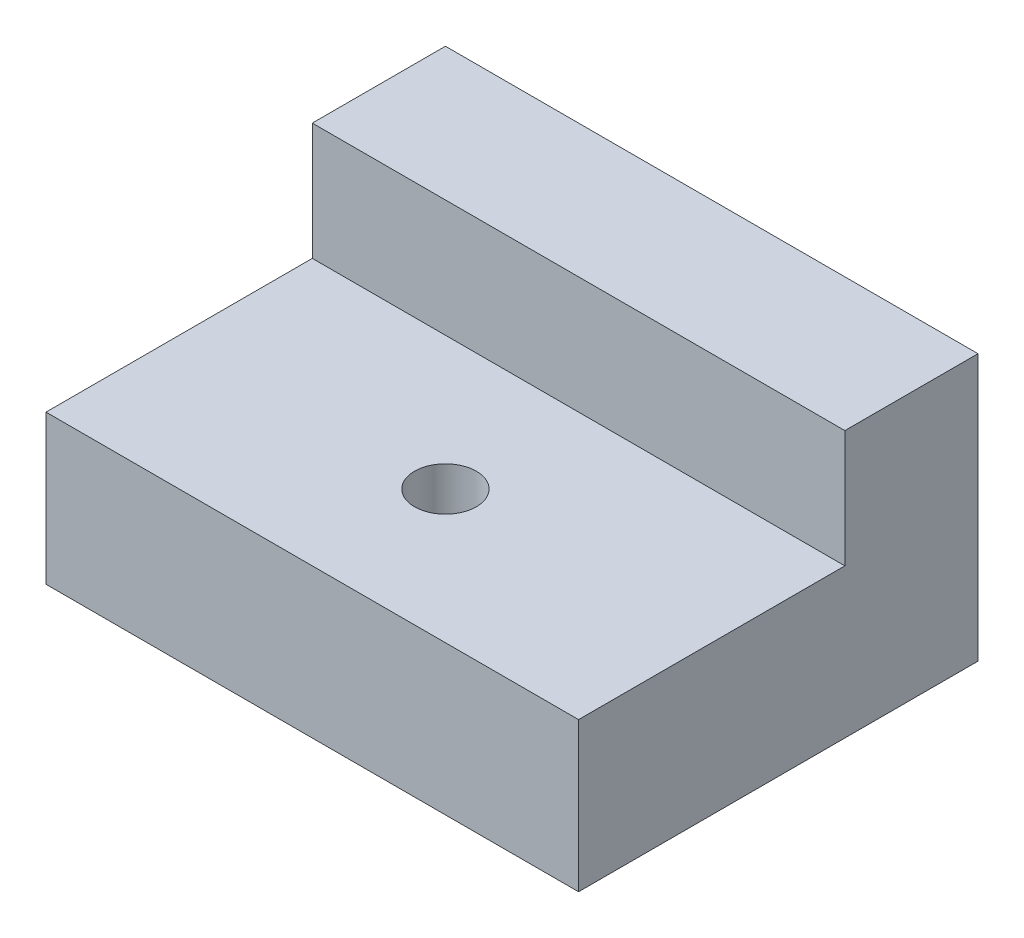
ISO-10303-21;
HEADER;
FILE_DESCRIPTION(('STEP AP214'),'2;1');
FILE_NAME('part.step','',(''),(''),'','','');
FILE_SCHEMA(('AUTOMOTIVE_DESIGN { 1 0 10303 214 1 1 1 1 }'));
ENDSEC;
DATA;
#1=APPLICATION_CONTEXT('core data for automotive mechanical design processes');
#2=APPLICATION_PROTOCOL_DEFINITION('international standard','automotive_design',2000,#1);
#3=PRODUCT_CONTEXT('',#1,'mechanical');
#4=PRODUCT('Part','Part','',(#3));
#5=PRODUCT_RELATED_PRODUCT_CATEGORY('part','',(#4));
#6=PRODUCT_DEFINITION_FORMATION('','',#4);
#7=PRODUCT_DEFINITION_CONTEXT('part definition',#1,'design');
#8=PRODUCT_DEFINITION('design','',#6,#7);
#9=PRODUCT_DEFINITION_SHAPE('','',#8);
#10=(LENGTH_UNIT() NAMED_UNIT(*) SI_UNIT(.MILLI.,.METRE.));
#11=(NAMED_UNIT(*) PLANE_ANGLE_UNIT() SI_UNIT($,.RADIAN.));
#12=(NAMED_UNIT(*) SI_UNIT($,.STERADIAN.) SOLID_ANGLE_UNIT());
#13=UNCERTAINTY_MEASURE_WITH_UNIT(LENGTH_MEASURE(1.E-05),#10,'distance_accuracy_value','');
#14=(GEOMETRIC_REPRESENTATION_CONTEXT(3) GLOBAL_UNCERTAINTY_ASSIGNED_CONTEXT((#13)) GLOBAL_UNIT_ASSIGNED_CONTEXT((#10,
#11,#12)) REPRESENTATION_CONTEXT('',''));
#15=CARTESIAN_POINT('',(0.,0.,0.));
#16=DIRECTION('',(0.,0.,1.));
#17=DIRECTION('',(1.,0.,0.));
#18=AXIS2_PLACEMENT_3D('',#15,#16,#17);
#19=CARTESIAN_POINT('',(0.,7.112,0.));
#20=DIRECTION('',(0.,-1.,0.));
#21=DIRECTION('',(0.,0.,-1.));
#22=AXIS2_PLACEMENT_3D('',#19,#20,#21);
#23=PLANE('',#22);
#24=CARTESIAN_POINT('',(12.7,7.112,-6.35));
#25=DIRECTION('',(0.,1.,0.));
#26=DIRECTION('',(0.,0.,1.));
#27=AXIS2_PLACEMENT_3D('',#24,#25,#26);
#28=CIRCLE('',#27,1.47319999999999);
#29=CARTESIAN_POINT('',(12.7,7.112,-4.87680000000001));
#30=VERTEX_POINT('',#29);
#31=EDGE_CURVE('E235',#30,#30,#28,.T.);
#32=ORIENTED_EDGE('',*,*,#31,.F.);
#33=EDGE_LOOP('',(#32));
#34=FACE_BOUND('',#33,.T.);
#35=DIRECTION('',(1.,0.,0.));
#36=VECTOR('',#35,1.);
#37=CARTESIAN_POINT('',(0.,7.112,-12.7));
#38=LINE('',#37,#36);
#39=CARTESIAN_POINT('',(0.,7.112,-12.7));
#40=VERTEX_POINT('',#39);
#41=CARTESIAN_POINT('',(25.4,7.112,-12.7));
#42=VERTEX_POINT('',#41);
#43=EDGE_CURVE('E48',#40,#42,#38,.T.);
#44=ORIENTED_EDGE('',*,*,#43,.F.);
#45=DIRECTION('',(0.,0.,1.));
#46=VECTOR('',#45,1.);
#47=CARTESIAN_POINT('',(0.,7.112,0.));
#48=LINE('',#47,#46);
#49=CARTESIAN_POINT('',(0.,7.112,0.));
#50=VERTEX_POINT('',#49);
#51=EDGE_CURVE('E85',#40,#50,#48,.T.);
#52=ORIENTED_EDGE('',*,*,#51,.T.);
#53=DIRECTION('',(1.,0.,0.));
#54=VECTOR('',#53,1.);
#55=CARTESIAN_POINT('',(0.,7.112,0.));
#56=LINE('',#55,#54);
#57=CARTESIAN_POINT('',(25.4,7.112,0.));
#58=VERTEX_POINT('',#57);
#59=EDGE_CURVE('E54',#50,#58,#56,.T.);
#60=ORIENTED_EDGE('',*,*,#59,.T.);
#61=DIRECTION('',(0.,0.,-1.));
#62=VECTOR('',#61,1.);
#63=CARTESIAN_POINT('',(25.4,7.112,0.));
#64=LINE('',#63,#62);
#65=EDGE_CURVE('E96',#58,#42,#64,.T.);
#66=ORIENTED_EDGE('',*,*,#65,.T.);
#67=EDGE_LOOP('',(#44,#52,#60,#66));
#68=FACE_BOUND('',#67,.T.);
#69=ADVANCED_FACE('F33',(#34,#68),#23,.F.);
#70=CARTESIAN_POINT('',(0.,7.112,0.));
#71=DIRECTION('',(1.,0.,0.));
#72=DIRECTION('',(0.,0.,-1.));
#73=AXIS2_PLACEMENT_3D('',#70,#71,#72);
#74=PLANE('',#73);
#75=DIRECTION('',(0.,0.,1.));
#76=VECTOR('',#75,1.);
#77=CARTESIAN_POINT('',(0.,0.,0.));
#78=LINE('',#77,#76);
#79=CARTESIAN_POINT('',(0.,0.,-19.05));
#80=VERTEX_POINT('',#79);
#81=CARTESIAN_POINT('',(0.,0.,0.));
#82=VERTEX_POINT('',#81);
#83=EDGE_CURVE('E92',#80,#82,#78,.T.);
#84=ORIENTED_EDGE('',*,*,#83,.T.);
#85=DIRECTION('',(0.,-1.,0.));
#86=VECTOR('',#85,1.);
#87=CARTESIAN_POINT('',(0.,7.112,0.));
#88=LINE('',#87,#86);
#89=EDGE_CURVE('E11',#50,#82,#88,.T.);
#90=ORIENTED_EDGE('',*,*,#89,.F.);
#91=ORIENTED_EDGE('',*,*,#51,.F.);
#92=DIRECTION('',(0.,-1.,0.));
#93=VECTOR('',#92,1.);
#94=CARTESIAN_POINT('',(0.,12.7,-12.7));
#95=LINE('',#94,#93);
#96=CARTESIAN_POINT('',(0.,12.7,-12.7));
#97=VERTEX_POINT('',#96);
#98=EDGE_CURVE('E100',#97,#40,#95,.T.);
#99=ORIENTED_EDGE('',*,*,#98,.F.);
#100=DIRECTION('',(0.,0.,1.));
#101=VECTOR('',#100,1.);
#102=CARTESIAN_POINT('',(0.,12.7,-19.05));
#103=LINE('',#102,#101);
#104=CARTESIAN_POINT('',(0.,12.7,-19.05));
#105=VERTEX_POINT('',#104);
#106=EDGE_CURVE('E95',#105,#97,#103,.T.);
#107=ORIENTED_EDGE('',*,*,#106,.F.);
#108=DIRECTION('',(0.,-1.,0.));
#109=VECTOR('',#108,1.);
#110=CARTESIAN_POINT('',(0.,7.112,-19.05));
#111=LINE('',#110,#109);
#112=EDGE_CURVE('E78',#105,#80,#111,.T.);
#113=ORIENTED_EDGE('',*,*,#112,.T.);
#114=EDGE_LOOP('',(#84,#90,#91,#99,#107,#113));
#115=FACE_BOUND('',#114,.T.);
#116=ADVANCED_FACE('F35',(#115),#74,.F.);
#117=CARTESIAN_POINT('',(0.,7.112,0.));
#118=DIRECTION('',(0.,0.,-1.));
#119=DIRECTION('',(-1.,0.,0.));
#120=AXIS2_PLACEMENT_3D('',#117,#118,#119);
#121=PLANE('',#120);
#122=DIRECTION('',(1.,0.,0.));
#123=VECTOR('',#122,1.);
#124=CARTESIAN_POINT('',(0.,0.,0.));
#125=LINE('',#124,#123);
#126=CARTESIAN_POINT('',(25.4,0.,0.));
#127=VERTEX_POINT('',#126);
#128=EDGE_CURVE('E99',#82,#127,#125,.T.);
#129=ORIENTED_EDGE('',*,*,#128,.T.);
#130=DIRECTION('',(0.,-1.,0.));
#131=VECTOR('',#130,1.);
#132=CARTESIAN_POINT('',(25.4,7.112,0.));
#133=LINE('',#132,#131);
#134=EDGE_CURVE('E41',#58,#127,#133,.T.);
#135=ORIENTED_EDGE('',*,*,#134,.F.);
#136=ORIENTED_EDGE('',*,*,#59,.F.);
#137=ORIENTED_EDGE('',*,*,#89,.T.);
#138=EDGE_LOOP('',(#129,#135,#136,#137));
#139=FACE_BOUND('',#138,.T.);
#140=ADVANCED_FACE('F116',(#139),#121,.F.);
#141=CARTESIAN_POINT('',(25.4,7.112,0.));
#142=DIRECTION('',(-1.,0.,0.));
#143=DIRECTION('',(0.,0.,1.));
#144=AXIS2_PLACEMENT_3D('',#141,#142,#143);
#145=PLANE('',#144);
#146=DIRECTION('',(0.,0.,-1.));
#147=VECTOR('',#146,1.);
#148=CARTESIAN_POINT('',(25.4,0.,0.));
#149=LINE('',#148,#147);
#150=CARTESIAN_POINT('',(25.4,0.,-19.05));
#151=VERTEX_POINT('',#150);
#152=EDGE_CURVE('E86',#127,#151,#149,.T.);
#153=ORIENTED_EDGE('',*,*,#152,.T.);
#154=DIRECTION('',(0.,-1.,0.));
#155=VECTOR('',#154,1.);
#156=CARTESIAN_POINT('',(25.4,7.112,-19.05));
#157=LINE('',#156,#155);
#158=CARTESIAN_POINT('',(25.4,12.7,-19.05));
#159=VERTEX_POINT('',#158);
#160=EDGE_CURVE('E81',#159,#151,#157,.T.);
#161=ORIENTED_EDGE('',*,*,#160,.F.);
#162=DIRECTION('',(0.,0.,-1.));
#163=VECTOR('',#162,1.);
#164=CARTESIAN_POINT('',(25.4,12.7,-19.05));
#165=LINE('',#164,#163);
#166=CARTESIAN_POINT('',(25.4,12.7,-12.7));
#167=VERTEX_POINT('',#166);
#168=EDGE_CURVE('E131',#167,#159,#165,.T.);
#169=ORIENTED_EDGE('',*,*,#168,.F.);
#170=DIRECTION('',(0.,-1.,0.));
#171=VECTOR('',#170,1.);
#172=CARTESIAN_POINT('',(25.4,12.7,-12.7));
#173=LINE('',#172,#171);
#174=EDGE_CURVE('E104',#167,#42,#173,.T.);
#175=ORIENTED_EDGE('',*,*,#174,.T.);
#176=ORIENTED_EDGE('',*,*,#65,.F.);
#177=ORIENTED_EDGE('',*,*,#134,.T.);
#178=EDGE_LOOP('',(#153,#161,#169,#175,#176,#177));
#179=FACE_BOUND('',#178,.T.);
#180=ADVANCED_FACE('F113',(#179),#145,.F.);
#181=CARTESIAN_POINT('',(0.,7.112,-19.05));
#182=DIRECTION('',(0.,0.,1.));
#183=DIRECTION('',(1.,0.,0.));
#184=AXIS2_PLACEMENT_3D('',#181,#182,#183);
#185=PLANE('',#184);
#186=DIRECTION('',(-1.,0.,0.));
#187=VECTOR('',#186,1.);
#188=CARTESIAN_POINT('',(0.,0.,-19.05));
#189=LINE('',#188,#187);
#190=EDGE_CURVE('E74',#151,#80,#189,.T.);
#191=ORIENTED_EDGE('',*,*,#190,.T.);
#192=ORIENTED_EDGE('',*,*,#112,.F.);
#193=DIRECTION('',(-1.,0.,0.));
#194=VECTOR('',#193,1.);
#195=CARTESIAN_POINT('',(0.,12.7,-19.05));
#196=LINE('',#195,#194);
#197=EDGE_CURVE('E134',#159,#105,#196,.T.);
#198=ORIENTED_EDGE('',*,*,#197,.F.);
#199=ORIENTED_EDGE('',*,*,#160,.T.);
#200=EDGE_LOOP('',(#191,#192,#198,#199));
#201=FACE_BOUND('',#200,.T.);
#202=ADVANCED_FACE('F76',(#201),#185,.F.);
#203=CARTESIAN_POINT('',(0.,0.,0.));
#204=DIRECTION('',(0.,-1.,0.));
#205=DIRECTION('',(0.,0.,-1.));
#206=AXIS2_PLACEMENT_3D('',#203,#204,#205);
#207=PLANE('',#206);
#208=CARTESIAN_POINT('',(12.7,0.,-6.35));
#209=DIRECTION('',(0.,1.,0.));
#210=DIRECTION('',(0.,0.,1.));
#211=AXIS2_PLACEMENT_3D('',#208,#209,#210);
#212=CIRCLE('',#211,1.4732);
#213=CARTESIAN_POINT('',(12.7,0.,-4.8768));
#214=VERTEX_POINT('',#213);
#215=EDGE_CURVE('E136',#214,#214,#212,.T.);
#216=ORIENTED_EDGE('',*,*,#215,.T.);
#217=EDGE_LOOP('',(#216));
#218=FACE_BOUND('',#217,.T.);
#219=ORIENTED_EDGE('',*,*,#83,.F.);
#220=ORIENTED_EDGE('',*,*,#190,.F.);
#221=ORIENTED_EDGE('',*,*,#152,.F.);
#222=ORIENTED_EDGE('',*,*,#128,.F.);
#223=EDGE_LOOP('',(#219,#220,#221,#222));
#224=FACE_BOUND('',#223,.T.);
#225=ADVANCED_FACE('F98',(#218,#224),#207,.T.);
#226=CARTESIAN_POINT('',(0.,12.7,-12.7));
#227=DIRECTION('',(0.,0.,-1.));
#228=DIRECTION('',(-1.,0.,0.));
#229=AXIS2_PLACEMENT_3D('',#226,#227,#228);
#230=PLANE('',#229);
#231=ORIENTED_EDGE('',*,*,#43,.T.);
#232=ORIENTED_EDGE('',*,*,#174,.F.);
#233=DIRECTION('',(1.,0.,0.));
#234=VECTOR('',#233,1.);
#235=CARTESIAN_POINT('',(0.,12.7,-12.7));
#236=LINE('',#235,#234);
#237=EDGE_CURVE('E125',#97,#167,#236,.T.);
#238=ORIENTED_EDGE('',*,*,#237,.F.);
#239=ORIENTED_EDGE('',*,*,#98,.T.);
#240=EDGE_LOOP('',(#231,#232,#238,#239));
#241=FACE_BOUND('',#240,.T.);
#242=ADVANCED_FACE('F121',(#241),#230,.F.);
#243=CARTESIAN_POINT('',(0.,12.7,0.));
#244=DIRECTION('',(0.,1.,0.));
#245=DIRECTION('',(0.,0.,1.));
#246=AXIS2_PLACEMENT_3D('',#243,#244,#245);
#247=PLANE('',#246);
#248=ORIENTED_EDGE('',*,*,#106,.T.);
#249=ORIENTED_EDGE('',*,*,#237,.T.);
#250=ORIENTED_EDGE('',*,*,#168,.T.);
#251=ORIENTED_EDGE('',*,*,#197,.T.);
#252=EDGE_LOOP('',(#248,#249,#250,#251));
#253=FACE_BOUND('',#252,.T.);
#254=ADVANCED_FACE('F133',(#253),#247,.T.);
#255=CARTESIAN_POINT('',(12.7,7.112,-6.35));
#256=DIRECTION('',(0.,1.,0.));
#257=DIRECTION('',(0.,0.,1.));
#258=AXIS2_PLACEMENT_3D('',#255,#256,#257);
#259=CYLINDRICAL_SURFACE('',#258,1.47319999999999);
#260=ORIENTED_EDGE('',*,*,#215,.F.);
#261=EDGE_LOOP('',(#260));
#262=FACE_BOUND('',#261,.T.);
#263=ORIENTED_EDGE('',*,*,#31,.T.);
#264=EDGE_LOOP('',(#263));
#265=FACE_BOUND('',#264,.T.);
#266=ADVANCED_FACE('F192',(#262,#265),#259,.F.);
#267=CLOSED_SHELL('',(#69,#116,#140,#180,#202,#225,#242,#254,#266));
#268=MANIFOLD_SOLID_BREP('B2',#267);
#269=ADVANCED_BREP_SHAPE_REPRESENTATION('',(#18,#268),#14);
#270=SHAPE_DEFINITION_REPRESENTATION(#9,#269);
ENDSEC;
END-ISO-10303-21;
